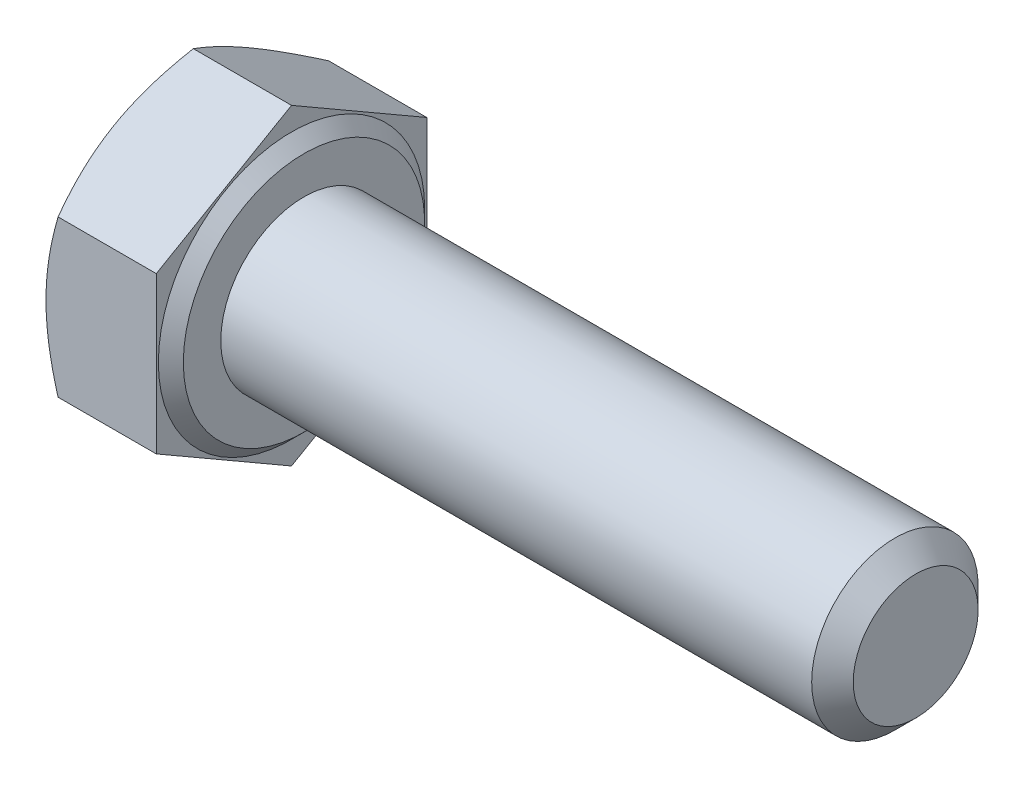
ISO-10303-21;
HEADER;
FILE_DESCRIPTION(('STEP AP214'),'2;1');
FILE_NAME('part.step','',(''),(''),'','','');
FILE_SCHEMA(('AUTOMOTIVE_DESIGN { 1 0 10303 214 1 1 1 1 }'));
ENDSEC;
DATA;
#1=APPLICATION_CONTEXT('core data for automotive mechanical design processes');
#2=APPLICATION_PROTOCOL_DEFINITION('international standard','automotive_design',2000,#1);
#3=PRODUCT_CONTEXT('',#1,'mechanical');
#4=PRODUCT('Part','Part','',(#3));
#5=PRODUCT_RELATED_PRODUCT_CATEGORY('part','',(#4));
#6=PRODUCT_DEFINITION_FORMATION('','',#4);
#7=PRODUCT_DEFINITION_CONTEXT('part definition',#1,'design');
#8=PRODUCT_DEFINITION('design','',#6,#7);
#9=PRODUCT_DEFINITION_SHAPE('','',#8);
#10=(LENGTH_UNIT() NAMED_UNIT(*) SI_UNIT(.MILLI.,.METRE.));
#11=(NAMED_UNIT(*) PLANE_ANGLE_UNIT() SI_UNIT($,.RADIAN.));
#12=(NAMED_UNIT(*) SI_UNIT($,.STERADIAN.) SOLID_ANGLE_UNIT());
#13=UNCERTAINTY_MEASURE_WITH_UNIT(LENGTH_MEASURE(1.E-05),#10,'distance_accuracy_value','');
#14=(GEOMETRIC_REPRESENTATION_CONTEXT(3) GLOBAL_UNCERTAINTY_ASSIGNED_CONTEXT((#13)) GLOBAL_UNIT_ASSIGNED_CONTEXT((#10,
#11,#12)) REPRESENTATION_CONTEXT('',''));
#15=CARTESIAN_POINT('',(0.,0.,0.));
#16=DIRECTION('',(0.,0.,1.));
#17=DIRECTION('',(1.,0.,0.));
#18=AXIS2_PLACEMENT_3D('',#15,#16,#17);
#19=CARTESIAN_POINT('',(2.65,-7.50555349946513,0.));
#20=DIRECTION('',(1.,0.,0.));
#21=DIRECTION('',(0.,0.,-1.));
#22=AXIS2_PLACEMENT_3D('',#19,#20,#21);
#23=PLANE('',#22);
#24=DIRECTION('',(0.,-0.5,-0.866025403784439));
#25=VECTOR('',#24,1.);
#26=CARTESIAN_POINT('',(2.65,-3.75277674973257,6.49999999999999));
#27=LINE('',#26,#25);
#28=CARTESIAN_POINT('',(2.65,-3.75277674973257,6.49999999999999));
#29=VERTEX_POINT('',#28);
#30=CARTESIAN_POINT('',(2.65,-7.50555349946513,0.));
#31=VERTEX_POINT('',#30);
#32=EDGE_CURVE('E121',#29,#31,#27,.T.);
#33=ORIENTED_EDGE('',*,*,#32,.T.);
#34=DIRECTION('',(0.,0.5,-0.866025403784439));
#35=VECTOR('',#34,1.);
#36=CARTESIAN_POINT('',(2.65,-7.50555349946513,0.));
#37=LINE('',#36,#35);
#38=CARTESIAN_POINT('',(2.65,-3.75277674973257,-6.5));
#39=VERTEX_POINT('',#38);
#40=EDGE_CURVE('E411',#31,#39,#37,.T.);
#41=ORIENTED_EDGE('',*,*,#40,.T.);
#42=DIRECTION('',(0.,1.,0.));
#43=VECTOR('',#42,1.);
#44=CARTESIAN_POINT('',(2.65,-3.75277674973257,-6.5));
#45=LINE('',#44,#43);
#46=CARTESIAN_POINT('',(2.65,3.75277674973257,-6.5));
#47=VERTEX_POINT('',#46);
#48=EDGE_CURVE('E417',#39,#47,#45,.T.);
#49=ORIENTED_EDGE('',*,*,#48,.T.);
#50=DIRECTION('',(0.,0.5,0.866025403784439));
#51=VECTOR('',#50,1.);
#52=CARTESIAN_POINT('',(2.65,3.75277674973257,-6.5));
#53=LINE('',#52,#51);
#54=CARTESIAN_POINT('',(2.65,7.50555349946513,0.));
#55=VERTEX_POINT('',#54);
#56=EDGE_CURVE('E416',#47,#55,#53,.T.);
#57=ORIENTED_EDGE('',*,*,#56,.T.);
#58=DIRECTION('',(0.,-0.5,0.866025403784439));
#59=VECTOR('',#58,1.);
#60=CARTESIAN_POINT('',(2.65,7.50555349946513,0.));
#61=LINE('',#60,#59);
#62=CARTESIAN_POINT('',(2.65,3.75277674973257,6.5));
#63=VERTEX_POINT('',#62);
#64=EDGE_CURVE('E294',#55,#63,#61,.T.);
#65=ORIENTED_EDGE('',*,*,#64,.T.);
#66=DIRECTION('',(0.,-1.,0.));
#67=VECTOR('',#66,1.);
#68=CARTESIAN_POINT('',(2.65,3.75277674973257,6.5));
#69=LINE('',#68,#67);
#70=EDGE_CURVE('E290',#63,#29,#69,.T.);
#71=ORIENTED_EDGE('',*,*,#70,.T.);
#72=EDGE_LOOP('',(#33,#41,#49,#57,#65,#71));
#73=FACE_BOUND('',#72,.T.);
#74=CARTESIAN_POINT('',(2.65,0.,0.));
#75=DIRECTION('',(-1.,0.,0.));
#76=DIRECTION('',(0.,0.,1.));
#77=AXIS2_PLACEMENT_3D('',#74,#75,#76);
#78=CIRCLE('',#77,6.4);
#79=CARTESIAN_POINT('',(2.65,0.,6.4));
#80=VERTEX_POINT('',#79);
#81=EDGE_CURVE('E229',#80,#80,#78,.T.);
#82=ORIENTED_EDGE('',*,*,#81,.T.);
#83=EDGE_LOOP('',(#82));
#84=FACE_BOUND('',#83,.T.);
#85=ADVANCED_FACE('F38',(#73,#84),#23,.T.);
#86=CARTESIAN_POINT('',(2.65,-3.75277674973257,6.49999999999999));
#87=DIRECTION('',(0.,0.866025403784439,-0.499999999999999));
#88=DIRECTION('',(0.,0.499999999999999,0.866025403784439));
#89=AXIS2_PLACEMENT_3D('',#86,#87,#88);
#90=PLANE('',#89);
#91=CARTESIAN_POINT('',(-2.06937674819414,-7.50566896951897,-0.000200000000000267));
#92=CARTESIAN_POINT('',(-2.11699557692452,-7.4231786300702,0.14267745905888));
#93=CARTESIAN_POINT('',(-2.1624532993973,-7.34038072665458,0.286087634534912));
#94=CARTESIAN_POINT('',(-2.24845131797696,-7.17411251123975,0.574072631317194));
#95=CARTESIAN_POINT('',(-2.28898949277198,-7.09064192560665,0.718647926571263));
#96=CARTESIAN_POINT('',(-2.4024289988768,-6.83889369625719,1.15468865052003));
#97=CARTESIAN_POINT('',(-2.46695219287126,-6.66962231516081,1.44787528284632));
#98=CARTESIAN_POINT('',(-2.54261341645251,-6.41631077211555,1.88662374554437));
#99=CARTESIAN_POINT('',(-2.56416714354301,-6.33302748139454,2.03087463649469));
#100=CARTESIAN_POINT('',(-2.60030968539388,-6.16608458377293,2.32002821713809));
#101=CARTESIAN_POINT('',(-2.61489911554033,-6.08242501078143,2.46493084809889));
#102=CARTESIAN_POINT('',(-2.63674124749265,-5.91496056339807,2.75498777942832));
#103=CARTESIAN_POINT('',(-2.64400227567789,-5.8311559625217,2.90014160605421));
#104=CARTESIAN_POINT('',(-2.65103969741777,-5.66347396979287,3.19057533697495));
#105=CARTESIAN_POINT('',(-2.65081632218779,-5.5795965802691,3.33585523723635));
#106=CARTESIAN_POINT('',(-2.63991654148483,-5.34979921898453,3.73387594242649));
#107=CARTESIAN_POINT('',(-2.62161818213059,-5.20395446807007,3.98648646102757));
#108=CARTESIAN_POINT('',(-2.56359365854233,-4.91323365606636,4.49002967823568));
#109=CARTESIAN_POINT('',(-2.52384766146176,-4.76835861741226,4.74096060593308));
#110=CARTESIAN_POINT('',(-2.42449409679785,-4.47705272008732,5.24551722064432));
#111=CARTESIAN_POINT('',(-2.36446557436198,-4.33065861912703,5.49907924143591));
#112=CARTESIAN_POINT('',(-2.22822500749014,-4.04005357906494,6.00242193575904));
#113=CARTESIAN_POINT('',(-2.15204496583641,-3.89583891821182,6.25220905555296));
#114=CARTESIAN_POINT('',(-2.06937674819414,-3.75266127967874,6.50019999999999));
#115=B_SPLINE_CURVE_WITH_KNOTS('',3,(#91,#92,#93,#94,#95,#96,#97,#98,#99,#100,#101,#102,#103,
#104,#105,#106,#107,#108,#109,#110,#111,#112,#113,#114),.UNSPECIFIED.,.F.,.F.,(4,2,2,2,2,2,2,2,
2,2,2,4),(0.,0.515105052395587,1.03043143507524,2.06322554824262,2.56697389547996,
3.07067772176453,3.57380860368927,4.07692394242519,4.95279354705659,5.82947446853465,
6.72559912449735,7.61996451221045),.UNSPECIFIED.);
#116=CARTESIAN_POINT('',(-2.06944341639924,-7.50555349946513,0.));
#117=VERTEX_POINT('',#116);
#118=CARTESIAN_POINT('',(-2.65,-5.62916512459885,3.25));
#119=VERTEX_POINT('',#118);
#120=EDGE_CURVE('E182',#117,#119,#115,.T.);
#121=ORIENTED_EDGE('',*,*,#120,.F.);
#122=DIRECTION('',(-1.,0.,0.));
#123=VECTOR('',#122,1.);
#124=CARTESIAN_POINT('',(2.65,-7.50555349946513,0.));
#125=LINE('',#124,#123);
#126=EDGE_CURVE('E135',#31,#117,#125,.T.);
#127=ORIENTED_EDGE('',*,*,#126,.F.);
#128=ORIENTED_EDGE('',*,*,#32,.F.);
#129=DIRECTION('',(-1.,0.,0.));
#130=VECTOR('',#129,1.);
#131=CARTESIAN_POINT('',(2.65,-3.75277674973257,6.49999999999999));
#132=LINE('',#131,#130);
#133=CARTESIAN_POINT('',(-2.06944341639942,-3.75277674973285,6.49999999999999));
#134=VERTEX_POINT('',#133);
#135=EDGE_CURVE('E287',#29,#134,#132,.T.);
#136=ORIENTED_EDGE('',*,*,#135,.T.);
#137=EDGE_CURVE('E177',#119,#134,#115,.T.);
#138=ORIENTED_EDGE('',*,*,#137,.F.);
#139=EDGE_LOOP('',(#121,#127,#128,#136,#138));
#140=FACE_BOUND('',#139,.T.);
#141=ADVANCED_FACE('F171',(#140),#90,.F.);
#142=CARTESIAN_POINT('',(2.65,-7.50555349946513,0.));
#143=DIRECTION('',(0.,0.866025403784439,0.5));
#144=DIRECTION('',(0.,-0.5,0.866025403784439));
#145=AXIS2_PLACEMENT_3D('',#142,#143,#144);
#146=PLANE('',#145);
#147=CARTESIAN_POINT('',(-2.06937674819414,-3.75266127967873,-6.5002));
#148=CARTESIAN_POINT('',(-2.11699557692452,-3.8351516191275,-6.35732254094112));
#149=CARTESIAN_POINT('',(-2.1624532993973,-3.91794952254312,-6.21391236546509));
#150=CARTESIAN_POINT('',(-2.24845131797696,-4.08421773795795,-5.9259273686828));
#151=CARTESIAN_POINT('',(-2.28898949277198,-4.16768832359105,-5.78135207342874));
#152=CARTESIAN_POINT('',(-2.40242899887679,-4.41943655294051,-5.34531134947997));
#153=CARTESIAN_POINT('',(-2.46695219287126,-4.58870793403689,-5.05212471715368));
#154=CARTESIAN_POINT('',(-2.54261341645251,-4.84201947708215,-4.61337625445563));
#155=CARTESIAN_POINT('',(-2.56416714354301,-4.92530276780316,-4.46912536350531));
#156=CARTESIAN_POINT('',(-2.60030968539388,-5.09224566542477,-4.17997178286191));
#157=CARTESIAN_POINT('',(-2.61489911554033,-5.17590523841627,-4.03506915190111));
#158=CARTESIAN_POINT('',(-2.63674124749265,-5.34336968579964,-3.74501222057168));
#159=CARTESIAN_POINT('',(-2.64400227567789,-5.427174286676,-3.59985839394579));
#160=CARTESIAN_POINT('',(-2.65103969741777,-5.59485627940483,-3.30942466302505));
#161=CARTESIAN_POINT('',(-2.6508163221878,-5.6787336689286,-3.16414476276364));
#162=CARTESIAN_POINT('',(-2.63991654148484,-5.90853103021317,-2.76612405757351));
#163=CARTESIAN_POINT('',(-2.62161818213059,-6.05437578112763,-2.51351353897243));
#164=CARTESIAN_POINT('',(-2.56359365854233,-6.34509659313134,-2.00997032176432));
#165=CARTESIAN_POINT('',(-2.52384766146176,-6.48997163178544,-1.75903939406692));
#166=CARTESIAN_POINT('',(-2.42449409679785,-6.78127752911038,-1.25448277935568));
#167=CARTESIAN_POINT('',(-2.36446557436198,-6.92767163007067,-1.00092075856409));
#168=CARTESIAN_POINT('',(-2.22822500749014,-7.21827667013276,-0.497578064240955));
#169=CARTESIAN_POINT('',(-2.15204496583641,-7.36249133098588,-0.247790944447036));
#170=CARTESIAN_POINT('',(-2.06937674819414,-7.50566896951897,0.000199999999999902));
#171=B_SPLINE_CURVE_WITH_KNOTS('',3,(#147,#148,#149,#150,#151,#152,#153,#154,#155,#156,#157,
#158,#159,#160,#161,#162,#163,#164,#165,#166,#167,#168,#169,#170),.UNSPECIFIED.,.F.,.F.,(4,2,2,
2,2,2,2,2,2,2,2,4),(0.,0.515105052395587,1.03043143507524,2.06322554824262,2.56697389547996,
3.07067772176453,3.57380860368927,4.07692394242519,4.9527935470566,5.82947446853466,
6.72559912449736,7.61996451221045),.UNSPECIFIED.);
#172=CARTESIAN_POINT('',(-2.06944341639924,-3.75277674973257,-6.5));
#173=VERTEX_POINT('',#172);
#174=CARTESIAN_POINT('',(-2.65,-5.62916512459885,-3.25));
#175=VERTEX_POINT('',#174);
#176=EDGE_CURVE('E130',#173,#175,#171,.T.);
#177=ORIENTED_EDGE('',*,*,#176,.F.);
#178=DIRECTION('',(-1.,0.,0.));
#179=VECTOR('',#178,1.);
#180=CARTESIAN_POINT('',(2.65,-3.75277674973257,-6.5));
#181=LINE('',#180,#179);
#182=EDGE_CURVE('E144',#39,#173,#181,.T.);
#183=ORIENTED_EDGE('',*,*,#182,.F.);
#184=ORIENTED_EDGE('',*,*,#40,.F.);
#185=ORIENTED_EDGE('',*,*,#126,.T.);
#186=EDGE_CURVE('E153',#175,#117,#171,.T.);
#187=ORIENTED_EDGE('',*,*,#186,.F.);
#188=EDGE_LOOP('',(#177,#183,#184,#185,#187));
#189=FACE_BOUND('',#188,.T.);
#190=ADVANCED_FACE('F166',(#189),#146,.F.);
#191=CARTESIAN_POINT('',(2.65,-3.75277674973257,-6.5));
#192=DIRECTION('',(0.,0.,1.));
#193=DIRECTION('',(0.,-1.,0.));
#194=AXIS2_PLACEMENT_3D('',#191,#192,#193);
#195=PLANE('',#194);
#196=CARTESIAN_POINT('',(0.60355373719635,-10.2477314892717,-6.5));
#197=CARTESIAN_POINT('',(0.464475261400692,-9.96239446416221,-6.5));
#198=CARTESIAN_POINT('',(0.32668274970438,-9.67642013820517,-6.5));
#199=CARTESIAN_POINT('',(0.0543896787091133,-9.10285860796694,-6.5));
#200=CARTESIAN_POINT('',(-0.0801103928031412,-8.81527117236299,-6.5));
#201=CARTESIAN_POINT('',(-0.345739945415969,-8.23674193681685,-6.5));
#202=CARTESIAN_POINT('',(-0.476848481026263,-7.9457904878189,-6.5));
#203=CARTESIAN_POINT('',(-0.733919368063302,-7.36163133412946,-6.5));
#204=CARTESIAN_POINT('',(-0.859881951865676,-7.06842373203112,-6.5));
#205=CARTESIAN_POINT('',(-1.1095154176263,-6.46918646835269,-6.5));
#206=CARTESIAN_POINT('',(-1.23295962840305,-6.16306188065731,-6.5));
#207=CARTESIAN_POINT('',(-1.47090398711428,-5.54729317546956,-6.5));
#208=CARTESIAN_POINT('',(-1.58540315491076,-5.23764867653513,-6.5));
#209=CARTESIAN_POINT('',(-1.80257373403833,-4.61487627079029,-6.5));
#210=CARTESIAN_POINT('',(-1.90526771872367,-4.30175631122758,-6.5));
#211=CARTESIAN_POINT('',(-2.09564259693755,-3.67102393290308,-6.5));
#212=CARTESIAN_POINT('',(-2.18332804620487,-3.35341290917758,-6.5));
#213=CARTESIAN_POINT('',(-2.33911527049905,-2.71533873469302,-6.5));
#214=CARTESIAN_POINT('',(-2.40732968158167,-2.39490351903324,-6.5));
#215=CARTESIAN_POINT('',(-2.52043149347748,-1.74983239904374,-6.5));
#216=CARTESIAN_POINT('',(-2.56532136485251,-1.42519694334302,-6.5));
#217=CARTESIAN_POINT('',(-2.61219056963229,-0.938551671037446,-6.5));
#218=CARTESIAN_POINT('',(-2.62438742928197,-0.777487825069509,-6.5));
#219=CARTESIAN_POINT('',(-2.64195788983122,-0.454981225817015,-6.5));
#220=CARTESIAN_POINT('',(-2.64733160864311,-0.293538479128636,-6.5));
#221=CARTESIAN_POINT('',(-2.6511195992042,0.0294278006686856,-6.5));
#222=CARTESIAN_POINT('',(-2.64953389424364,0.190951333505462,-6.5));
#223=CARTESIAN_POINT('',(-2.63944563744444,0.513784532096948,-6.5));
#224=CARTESIAN_POINT('',(-2.63094277147445,0.675094187805539,-6.5));
#225=CARTESIAN_POINT('',(-2.60274594615385,1.05782021915585,-6.5));
#226=CARTESIAN_POINT('',(-2.58004535742526,1.2790201787771,-6.5));
#227=CARTESIAN_POINT('',(-2.52283806687712,1.71987609764738,-6.5));
#228=CARTESIAN_POINT('',(-2.4883298965269,1.93953186137231,-6.5));
#229=CARTESIAN_POINT('',(-2.36891552307362,2.5958774986214,-6.5));
#230=CARTESIAN_POINT('',(-2.26813808604729,3.02972351119424,-6.5));
#231=CARTESIAN_POINT('',(-2.0921348657605,3.6786620168305,-6.5));
#232=CARTESIAN_POINT('',(-2.0284757231639,3.89708630013132,-6.5));
#233=CARTESIAN_POINT('',(-1.89423191702726,4.33181713101748,-6.5));
#234=CARTESIAN_POINT('',(-1.82364720395261,4.5481236634436,-6.5));
#235=CARTESIAN_POINT('',(-1.67671049639938,4.97868097873234,-6.5));
#236=CARTESIAN_POINT('',(-1.60036016744911,5.19293233527614,-6.5));
#237=CARTESIAN_POINT('',(-1.44282164032818,5.61963919711557,-6.5));
#238=CARTESIAN_POINT('',(-1.36163352310401,5.83209473239124,-6.5));
#239=CARTESIAN_POINT('',(-1.1520726731286,6.36515493176347,-6.5));
#240=CARTESIAN_POINT('',(-1.02106063071126,6.68472057021892,-6.5));
#241=CARTESIAN_POINT('',(-0.751881137922848,7.32083421355234,-6.5));
#242=CARTESIAN_POINT('',(-0.613713082142333,7.63738196042088,-6.5));
#243=CARTESIAN_POINT('',(-0.331771759273816,8.26807891677026,-6.5));
#244=CARTESIAN_POINT('',(-0.187996803941277,8.58222736923566,-6.5));
#245=CARTESIAN_POINT('',(0.103931221831426,9.2084658296306,-6.5));
#246=CARTESIAN_POINT('',(0.252084160437177,9.52055589919884,-6.5));
#247=CARTESIAN_POINT('',(0.552090353552636,10.1434744571842,-6.5));
#248=CARTESIAN_POINT('',(0.703948386045167,10.4543006400647,-6.49999999999999));
#249=CARTESIAN_POINT('',(1.01050097070058,11.0745509046012,-6.49999999999999));
#250=CARTESIAN_POINT('',(1.16519554010106,11.3839749777224,-6.49999999999999));
#251=CARTESIAN_POINT('',(1.63267217813975,12.3103970834787,-6.49999999999999));
#252=CARTESIAN_POINT('',(1.94890085256161,12.9256554316128,-6.49999999999999));
#253=CARTESIAN_POINT('',(2.55757712504277,14.0950777618092,-6.49999999999999));
#254=CARTESIAN_POINT('',(2.84945902750468,14.649537598818,-6.49999999999999));
#255=CARTESIAN_POINT('',(3.4370774767159,15.7564437556878,-6.49999999999999));
#256=CARTESIAN_POINT('',(3.73281420813998,16.3088899774474,-6.49999999999999));
#257=CARTESIAN_POINT('',(4.32629070605834,17.4105689728968,-6.49999999999999));
#258=CARTESIAN_POINT('',(4.62402181990693,17.9598064153872,-6.49999999999999));
#259=CARTESIAN_POINT('',(5.22172897927089,19.0570108358403,-6.49999999999999));
#260=CARTESIAN_POINT('',(5.52170487175015,19.6049778971337,-6.49999999999999));
#261=CARTESIAN_POINT('',(5.82250786924368,20.1524874902564,-6.49999999999999));
#262=B_SPLINE_CURVE_WITH_KNOTS('',3,(#196,#197,#198,#199,#200,#201,#202,#203,#204,#205,#206,
#207,#208,#209,#210,#211,#212,#213,#214,#215,#216,#217,#218,#219,#220,#221,#222,#223,#224,#225,
#226,#227,#228,#229,#230,#231,#232,#233,#234,#235,#236,#237,#238,#239,#240,#241,#242,#243,#244,
#245,#246,#247,#248,#249,#250,#251,#252,#253,#254,#255,#256,#257,#258,#259,#260,#261),
.UNSPECIFIED.,.F.,.F.,(4,2,2,2,2,2,2,2,2,2,2,2,2,2,2,2,2,2,2,2,2,2,2,2,2,2,2,2,2,2,2,2,4),(0.,
0.952292516357866,1.90472527465286,2.86206700064244,3.8193654480801,4.80948803045334,
5.79971895211504,6.78802374229957,7.77602800522182,8.75819533488333,9.74025861104353,
10.2247110886823,10.7091551942693,11.1935976786284,11.6780621643656,12.3447741448776,
13.0115690757446,14.3458248640298,15.0282989510481,15.7107779197667,16.3930604876938,
17.0753316427859,18.1113441188636,19.1474443867775,20.1838590716921,21.2202425787431,
22.2580417221914,23.2958471744244,25.3710897721764,27.2508576445298,29.1307159050742,
31.004943596792,32.8790446578319),.UNSPECIFIED.);
#263=CARTESIAN_POINT('',(-2.06944341639924,3.75277674973257,-6.5));
#264=VERTEX_POINT('',#263);
#265=CARTESIAN_POINT('',(-2.65,0.,-6.5));
#266=VERTEX_POINT('',#265);
#267=EDGE_CURVE('E109',#264,#266,#262,.F.);
#268=ORIENTED_EDGE('',*,*,#267,.F.);
#269=DIRECTION('',(-1.,0.,0.));
#270=VECTOR('',#269,1.);
#271=CARTESIAN_POINT('',(2.65,3.75277674973257,-6.5));
#272=LINE('',#271,#270);
#273=EDGE_CURVE('E300',#47,#264,#272,.T.);
#274=ORIENTED_EDGE('',*,*,#273,.F.);
#275=ORIENTED_EDGE('',*,*,#48,.F.);
#276=ORIENTED_EDGE('',*,*,#182,.T.);
#277=EDGE_CURVE('E122',#266,#173,#262,.F.);
#278=ORIENTED_EDGE('',*,*,#277,.F.);
#279=EDGE_LOOP('',(#268,#274,#275,#276,#278));
#280=FACE_BOUND('',#279,.T.);
#281=ADVANCED_FACE('F141',(#280),#195,.F.);
#282=CARTESIAN_POINT('',(2.65,3.75277674973257,-6.5));
#283=DIRECTION('',(0.,-0.866025403784439,0.5));
#284=DIRECTION('',(0.,-0.5,-0.866025403784439));
#285=AXIS2_PLACEMENT_3D('',#282,#283,#284);
#286=PLANE('',#285);
#287=CARTESIAN_POINT('',(-2.06937674819414,7.50566896951897,0.000200000000003345));
#288=CARTESIAN_POINT('',(-2.11699557692452,7.4231786300702,-0.142677459058877));
#289=CARTESIAN_POINT('',(-2.1624532993973,7.34038072665458,-0.286087634534909));
#290=CARTESIAN_POINT('',(-2.24845131797696,7.17411251123976,-0.57407263131719));
#291=CARTESIAN_POINT('',(-2.28898949277198,7.09064192560665,-0.71864792657126));
#292=CARTESIAN_POINT('',(-2.40242899887679,6.83889369625719,-1.15468865052003));
#293=CARTESIAN_POINT('',(-2.46695219287126,6.66962231516081,-1.44787528284631));
#294=CARTESIAN_POINT('',(-2.54261341645251,6.41631077211555,-1.88662374554437));
#295=CARTESIAN_POINT('',(-2.56416714354301,6.33302748139454,-2.03087463649468));
#296=CARTESIAN_POINT('',(-2.60030968539388,6.16608458377293,-2.32002821713808));
#297=CARTESIAN_POINT('',(-2.61489911554033,6.08242501078143,-2.46493084809888));
#298=CARTESIAN_POINT('',(-2.63674124749265,5.91496056339807,-2.75498777942831));
#299=CARTESIAN_POINT('',(-2.64400227567789,5.83115596252171,-2.9001416060542));
#300=CARTESIAN_POINT('',(-2.65103969741777,5.66347396979287,-3.19057533697494));
#301=CARTESIAN_POINT('',(-2.6508163221878,5.5795965802691,-3.33585523723635));
#302=CARTESIAN_POINT('',(-2.63991654148484,5.34979921898453,-3.73387594242649));
#303=CARTESIAN_POINT('',(-2.62161818213059,5.20395446807007,-3.98648646102757));
#304=CARTESIAN_POINT('',(-2.56359365854233,4.91323365606636,-4.49002967823567));
#305=CARTESIAN_POINT('',(-2.52384766146176,4.76835861741226,-4.74096060593308));
#306=CARTESIAN_POINT('',(-2.42449409679785,4.47705272008732,-5.24551722064432));
#307=CARTESIAN_POINT('',(-2.36446557436198,4.33065861912703,-5.49907924143591));
#308=CARTESIAN_POINT('',(-2.22822500749014,4.04005357906494,-6.00242193575904));
#309=CARTESIAN_POINT('',(-2.15204496583641,3.89583891821182,-6.25220905555296));
#310=CARTESIAN_POINT('',(-2.06937674819414,3.75266127967873,-6.5002));
#311=B_SPLINE_CURVE_WITH_KNOTS('',3,(#287,#288,#289,#290,#291,#292,#293,#294,#295,#296,#297,
#298,#299,#300,#301,#302,#303,#304,#305,#306,#307,#308,#309,#310),.UNSPECIFIED.,.F.,.F.,(4,2,2,
2,2,2,2,2,2,2,2,4),(0.,0.515105052395586,1.03043143507524,2.06322554824262,2.56697389547996,
3.07067772176453,3.57380860368927,4.07692394242519,4.9527935470566,5.82947446853466,
6.72559912449736,7.61996451221045),.UNSPECIFIED.);
#312=CARTESIAN_POINT('',(-2.06944341639924,7.50555349946513,0.));
#313=VERTEX_POINT('',#312);
#314=CARTESIAN_POINT('',(-2.65,5.62916512459885,-3.25));
#315=VERTEX_POINT('',#314);
#316=EDGE_CURVE('E53',#313,#315,#311,.T.);
#317=ORIENTED_EDGE('',*,*,#316,.F.);
#318=DIRECTION('',(-1.,0.,0.));
#319=VECTOR('',#318,1.);
#320=CARTESIAN_POINT('',(2.65,7.50555349946513,0.));
#321=LINE('',#320,#319);
#322=EDGE_CURVE('E292',#55,#313,#321,.T.);
#323=ORIENTED_EDGE('',*,*,#322,.F.);
#324=ORIENTED_EDGE('',*,*,#56,.F.);
#325=ORIENTED_EDGE('',*,*,#273,.T.);
#326=EDGE_CURVE('E116',#315,#264,#311,.T.);
#327=ORIENTED_EDGE('',*,*,#326,.F.);
#328=EDGE_LOOP('',(#317,#323,#324,#325,#327));
#329=FACE_BOUND('',#328,.T.);
#330=ADVANCED_FACE('F165',(#329),#286,.F.);
#331=CARTESIAN_POINT('',(2.65,7.50555349946513,0.));
#332=DIRECTION('',(0.,-0.866025403784439,-0.5));
#333=DIRECTION('',(0.,0.5,-0.866025403784439));
#334=AXIS2_PLACEMENT_3D('',#331,#332,#333);
#335=PLANE('',#334);
#336=CARTESIAN_POINT('',(-2.06937674819414,3.75266127967873,6.5002));
#337=CARTESIAN_POINT('',(-2.11699557692452,3.83515161912751,6.35732254094111));
#338=CARTESIAN_POINT('',(-2.1624532993973,3.91794952254313,6.21391236546508));
#339=CARTESIAN_POINT('',(-2.24845131797696,4.08421773795795,5.9259273686828));
#340=CARTESIAN_POINT('',(-2.28898949277198,4.16768832359106,5.78135207342873));
#341=CARTESIAN_POINT('',(-2.40242899887679,4.41943655294052,5.34531134947996));
#342=CARTESIAN_POINT('',(-2.46695219287126,4.5887079340369,5.05212471715368));
#343=CARTESIAN_POINT('',(-2.54261341645251,4.84201947708216,4.61337625445562));
#344=CARTESIAN_POINT('',(-2.56416714354301,4.92530276780316,4.46912536350531));
#345=CARTESIAN_POINT('',(-2.60030968539388,5.09224566542477,4.17997178286191));
#346=CARTESIAN_POINT('',(-2.61489911554033,5.17590523841628,4.03506915190111));
#347=CARTESIAN_POINT('',(-2.63674124749265,5.34336968579964,3.74501222057168));
#348=CARTESIAN_POINT('',(-2.64400227567789,5.427174286676,3.59985839394579));
#349=CARTESIAN_POINT('',(-2.65103969741777,5.59485627940484,3.30942466302505));
#350=CARTESIAN_POINT('',(-2.65081632218779,5.6787336689286,3.16414476276364));
#351=CARTESIAN_POINT('',(-2.63991654148483,5.90853103021317,2.76612405757351));
#352=CARTESIAN_POINT('',(-2.62161818213059,6.05437578112764,2.51351353897243));
#353=CARTESIAN_POINT('',(-2.56359365854232,6.34509659313135,2.00997032176432));
#354=CARTESIAN_POINT('',(-2.52384766146176,6.48997163178545,1.75903939406692));
#355=CARTESIAN_POINT('',(-2.42449409679785,6.78127752911039,1.25448277935568));
#356=CARTESIAN_POINT('',(-2.36446557436198,6.92767163007068,1.00092075856409));
#357=CARTESIAN_POINT('',(-2.22822500749014,7.21827667013277,0.497578064240958));
#358=CARTESIAN_POINT('',(-2.15204496583641,7.36249133098589,0.247790944447039));
#359=CARTESIAN_POINT('',(-2.06937674819414,7.50566896951897,-0.000199999999996806));
#360=B_SPLINE_CURVE_WITH_KNOTS('',3,(#336,#337,#338,#339,#340,#341,#342,#343,#344,#345,#346,
#347,#348,#349,#350,#351,#352,#353,#354,#355,#356,#357,#358,#359),.UNSPECIFIED.,.F.,.F.,(4,2,2,
2,2,2,2,2,2,2,2,4),(0.,0.515105052395587,1.03043143507524,2.06322554824262,2.56697389547996,
3.07067772176453,3.57380860368927,4.07692394242519,4.95279354705659,5.82947446853465,
6.72559912449735,7.61996451221045),.UNSPECIFIED.);
#361=CARTESIAN_POINT('',(-2.06944341639924,3.75277674973257,6.5));
#362=VERTEX_POINT('',#361);
#363=CARTESIAN_POINT('',(-2.65,5.62916512459885,3.25));
#364=VERTEX_POINT('',#363);
#365=EDGE_CURVE('E61',#362,#364,#360,.T.);
#366=ORIENTED_EDGE('',*,*,#365,.F.);
#367=DIRECTION('',(-1.,0.,0.));
#368=VECTOR('',#367,1.);
#369=CARTESIAN_POINT('',(2.65,3.75277674973257,6.5));
#370=LINE('',#369,#368);
#371=EDGE_CURVE('E289',#63,#362,#370,.T.);
#372=ORIENTED_EDGE('',*,*,#371,.F.);
#373=ORIENTED_EDGE('',*,*,#64,.F.);
#374=ORIENTED_EDGE('',*,*,#322,.T.);
#375=EDGE_CURVE('E190',#364,#313,#360,.T.);
#376=ORIENTED_EDGE('',*,*,#375,.F.);
#377=EDGE_LOOP('',(#366,#372,#373,#374,#376));
#378=FACE_BOUND('',#377,.T.);
#379=ADVANCED_FACE('F210',(#378),#335,.F.);
#380=CARTESIAN_POINT('',(2.65,3.75277674973257,6.5));
#381=DIRECTION('',(0.,0.,-1.));
#382=DIRECTION('',(0.,1.,0.));
#383=AXIS2_PLACEMENT_3D('',#380,#381,#382);
#384=PLANE('',#383);
#385=CARTESIAN_POINT('',(0.603553733516687,-10.2477314817244,6.49999999999999));
#386=CARTESIAN_POINT('',(0.464475257874193,-9.96239445686887,6.49999999999999));
#387=CARTESIAN_POINT('',(0.32668274633096,-9.67642013116599,6.49999999999999));
#388=CARTESIAN_POINT('',(0.0543896756411171,-9.10285860143683,6.49999999999999));
#389=CARTESIAN_POINT('',(-0.080110395718793,-8.8152711660878,6.49999999999999));
#390=CARTESIAN_POINT('',(-0.345739948026859,-8.2367419310553,6.49999999999999));
#391=CARTESIAN_POINT('',(-0.476848483484763,-7.9457904823161,6.49999999999999));
#392=CARTESIAN_POINT('',(-0.733919370219514,-7.36163132914587,6.49999999999999));
#393=CARTESIAN_POINT('',(-0.859881953871992,-7.06842372730801,6.49999999999999));
#394=CARTESIAN_POINT('',(-1.10951541932795,-6.46918646417171,6.49999999999999));
#395=CARTESIAN_POINT('',(-1.23295962995029,-6.16306187675817,6.49999999999999));
#396=CARTESIAN_POINT('',(-1.47090398836086,-5.54729317213859,6.49999999999999));
#397=CARTESIAN_POINT('',(-1.58540315601109,-5.23764867349049,6.49999999999999));
#398=CARTESIAN_POINT('',(-1.80257373485996,-4.6148762683236,6.49999999999999));
#399=CARTESIAN_POINT('',(-1.90526771941281,-4.30175630905248,6.49999999999999));
#400=CARTESIAN_POINT('',(-2.09564259738307,-3.67102393131906,6.49999999999999));
#401=CARTESIAN_POINT('',(-2.18332804653923,-3.35341290789304,6.49999999999999));
#402=CARTESIAN_POINT('',(-2.33911527060884,-2.71533873415901,6.49999999999999));
#403=CARTESIAN_POINT('',(-2.4073296815864,-2.39490351895232,6.49999999999999));
#404=CARTESIAN_POINT('',(-2.52043149334024,-1.74983239988033,6.49999999999999));
#405=CARTESIAN_POINT('',(-2.5653213646783,-1.42519694464404,6.49999999999999));
#406=CARTESIAN_POINT('',(-2.61219056946443,-0.938551673031906,6.49999999999999));
#407=CARTESIAN_POINT('',(-2.62438742912625,-0.777487827291692,6.49999999999999));
#408=CARTESIAN_POINT('',(-2.64195788971997,-0.454981228494312,6.49999999999999));
#409=CARTESIAN_POINT('',(-2.64733160856417,-0.293538482033324,6.49999999999999));
#410=CARTESIAN_POINT('',(-2.6511195992097,0.0294277973108626,6.49999999999999));
#411=CARTESIAN_POINT('',(-2.64953389430128,0.190951329921896,6.5));
#412=CARTESIAN_POINT('',(-2.63944563762482,0.513784528064791,6.5));
#413=CARTESIAN_POINT('',(-2.63094277172542,0.675094183550535,6.5));
#414=CARTESIAN_POINT('',(-2.60274594657838,1.05782021455984,6.5));
#415=CARTESIAN_POINT('',(-2.58004535794947,1.2790201740639,6.5));
#416=CARTESIAN_POINT('',(-2.52283806760597,1.71987609270518,6.5));
#417=CARTESIAN_POINT('',(-2.48832989736071,1.93953185631832,6.5));
#418=CARTESIAN_POINT('',(-2.36891552422446,2.59587749323826,6.5));
#419=CARTESIAN_POINT('',(-2.26813808741218,3.02972350560051,6.5));
#420=CARTESIAN_POINT('',(-2.09213486744098,3.67866201092192,6.5));
#421=CARTESIAN_POINT('',(-2.02847572495024,3.89708629411556,6.5));
#422=CARTESIAN_POINT('',(-1.894231919022,4.3318171247886,6.5));
#423=CARTESIAN_POINT('',(-1.82364720604987,4.54812365710878,6.5));
#424=CARTESIAN_POINT('',(-1.67671049869794,4.97868097218646,6.5));
#425=CARTESIAN_POINT('',(-1.60036016984643,5.19293232862512,6.5));
#426=CARTESIAN_POINT('',(-1.44282164291949,5.61963919025429,6.5));
#427=CARTESIAN_POINT('',(-1.36163352579055,5.83209472542482,6.5));
#428=CARTESIAN_POINT('',(-1.15207267597255,6.36515492473125,6.5));
#429=CARTESIAN_POINT('',(-1.02106063360947,6.68472056322357,6.5));
#430=CARTESIAN_POINT('',(-0.751881140915584,7.32083420662624,6.5));
#431=CARTESIAN_POINT('',(-0.613713085175322,7.63738195352715,6.5));
#432=CARTESIAN_POINT('',(-0.331771762376821,8.26807890993788,6.5));
#433=CARTESIAN_POINT('',(-0.187996807074036,8.58222736243227,6.5));
#434=CARTESIAN_POINT('',(0.103931218646835,9.20846582288206,6.5));
#435=CARTESIAN_POINT('',(0.252084157230505,9.52055589247617,6.5));
#436=CARTESIAN_POINT('',(0.552090350308237,10.1434744505123,6.5));
#437=CARTESIAN_POINT('',(0.703948382785144,10.4543006334176,6.5));
#438=CARTESIAN_POINT('',(1.01050096741376,11.0745508980019,6.5));
#439=CARTESIAN_POINT('',(1.16519553680306,11.3839749711459,6.5));
#440=CARTESIAN_POINT('',(1.6326721748131,12.3103970769681,6.5));
#441=CARTESIAN_POINT('',(1.94890084922256,12.9256554251429,6.5));
#442=CARTESIAN_POINT('',(2.5575771216728,14.0950777553839,6.5));
#443=CARTESIAN_POINT('',(2.84945902411519,14.649537592397,6.5));
#444=CARTESIAN_POINT('',(3.43707747329168,15.7564437492737,6.5));
#445=CARTESIAN_POINT('',(3.73281420470055,16.3088899710356,6.5));
#446=CARTESIAN_POINT('',(4.3262907025885,17.4105689664828,6.5));
#447=CARTESIAN_POINT('',(4.62402181642185,17.9598064089686,6.5));
#448=CARTESIAN_POINT('',(5.22172897575737,19.0570108294112,6.5));
#449=CARTESIAN_POINT('',(5.52170486822343,19.6049778906988,6.5));
#450=CARTESIAN_POINT('',(5.82250786570444,20.1524874838153,6.5));
#451=B_SPLINE_CURVE_WITH_KNOTS('',3,(#385,#386,#387,#388,#389,#390,#391,#392,#393,#394,#395,
#396,#397,#398,#399,#400,#401,#402,#403,#404,#405,#406,#407,#408,#409,#410,#411,#412,#413,#414,
#415,#416,#417,#418,#419,#420,#421,#422,#423,#424,#425,#426,#427,#428,#429,#430,#431,#432,#433,
#434,#435,#436,#437,#438,#439,#440,#441,#442,#443,#444,#445,#446,#447,#448,#449,#450),
.UNSPECIFIED.,.F.,.F.,(4,2,2,2,2,2,2,2,2,2,2,2,2,2,2,2,2,2,2,2,2,2,2,2,2,2,2,2,2,2,2,2,4),(0.,
0.952292515471637,1.90472527288027,2.86206699797432,3.81936544451653,4.80948802593244,
5.79971894663649,6.78802373586644,7.77602799783484,8.75819532610407,9.74025860087401,
10.2247110778348,10.709155182744,11.193597666425,11.678062151484,12.3447741316159,
13.0115690621028,14.3458248496262,15.0282989362467,15.7107779045676,16.3930604720981,
17.0753316267935,18.1113441029113,19.1474443708656,20.1838590558219,21.2202425629146,
22.2580417064093,23.2958471586887,25.3710897565319,27.2508576288698,29.1307158893989,
31.0049435810827,32.8790446420883),.UNSPECIFIED.);
#452=CARTESIAN_POINT('',(-2.65,0.,6.5));
#453=VERTEX_POINT('',#452);
#454=EDGE_CURVE('E192',#134,#453,#451,.T.);
#455=ORIENTED_EDGE('',*,*,#454,.F.);
#456=ORIENTED_EDGE('',*,*,#135,.F.);
#457=ORIENTED_EDGE('',*,*,#70,.F.);
#458=ORIENTED_EDGE('',*,*,#371,.T.);
#459=EDGE_CURVE('E194',#453,#362,#451,.T.);
#460=ORIENTED_EDGE('',*,*,#459,.F.);
#461=EDGE_LOOP('',(#455,#456,#457,#458,#460));
#462=FACE_BOUND('',#461,.T.);
#463=ADVANCED_FACE('F206',(#462),#384,.F.);
#464=CARTESIAN_POINT('',(-2.65,0.,0.));
#465=DIRECTION('',(1.,0.,0.));
#466=DIRECTION('',(0.,0.,-1.));
#467=AXIS2_PLACEMENT_3D('',#464,#465,#466);
#468=CONICAL_SURFACE('',#467,6.5,1.0471975511966);
#469=ORIENTED_EDGE('',*,*,#277,.T.);
#470=ORIENTED_EDGE('',*,*,#176,.T.);
#471=CARTESIAN_POINT('',(-2.65,0.,0.));
#472=DIRECTION('',(1.,0.,0.));
#473=DIRECTION('',(0.,0.,-1.));
#474=AXIS2_PLACEMENT_3D('',#471,#472,#473);
#475=CIRCLE('',#474,6.5);
#476=EDGE_CURVE('E127',#175,#266,#475,.T.);
#477=ORIENTED_EDGE('',*,*,#476,.T.);
#478=EDGE_LOOP('',(#469,#470,#477));
#479=FACE_BOUND('',#478,.T.);
#480=ADVANCED_FACE('F128',(#479),#468,.T.);
#481=ORIENTED_EDGE('',*,*,#186,.T.);
#482=ORIENTED_EDGE('',*,*,#120,.T.);
#483=EDGE_CURVE('E134',#119,#175,#475,.T.);
#484=ORIENTED_EDGE('',*,*,#483,.T.);
#485=EDGE_LOOP('',(#481,#482,#484));
#486=FACE_BOUND('',#485,.T.);
#487=ADVANCED_FACE('F271',(#486),#468,.T.);
#488=ORIENTED_EDGE('',*,*,#137,.T.);
#489=ORIENTED_EDGE('',*,*,#454,.T.);
#490=EDGE_CURVE('E282',#453,#119,#475,.T.);
#491=ORIENTED_EDGE('',*,*,#490,.T.);
#492=EDGE_LOOP('',(#488,#489,#491));
#493=FACE_BOUND('',#492,.T.);
#494=ADVANCED_FACE('F270',(#493),#468,.T.);
#495=ORIENTED_EDGE('',*,*,#365,.T.);
#496=CARTESIAN_POINT('',(-2.65,0.,0.));
#497=DIRECTION('',(-1.,0.,0.));
#498=DIRECTION('',(0.,0.,1.));
#499=AXIS2_PLACEMENT_3D('',#496,#497,#498);
#500=CIRCLE('',#499,6.5);
#501=EDGE_CURVE('E199',#453,#364,#500,.T.);
#502=ORIENTED_EDGE('',*,*,#501,.F.);
#503=ORIENTED_EDGE('',*,*,#459,.T.);
#504=EDGE_LOOP('',(#495,#502,#503));
#505=FACE_BOUND('',#504,.T.);
#506=ADVANCED_FACE('F266',(#505),#468,.T.);
#507=ORIENTED_EDGE('',*,*,#316,.T.);
#508=EDGE_CURVE('E139',#315,#364,#475,.T.);
#509=ORIENTED_EDGE('',*,*,#508,.T.);
#510=ORIENTED_EDGE('',*,*,#375,.T.);
#511=EDGE_LOOP('',(#507,#509,#510));
#512=FACE_BOUND('',#511,.T.);
#513=ADVANCED_FACE('F265',(#512),#468,.T.);
#514=ORIENTED_EDGE('',*,*,#267,.T.);
#515=EDGE_CURVE('E113',#266,#315,#475,.T.);
#516=ORIENTED_EDGE('',*,*,#515,.T.);
#517=ORIENTED_EDGE('',*,*,#326,.T.);
#518=EDGE_LOOP('',(#514,#516,#517));
#519=FACE_BOUND('',#518,.T.);
#520=ADVANCED_FACE('F111',(#519),#468,.T.);
#521=CARTESIAN_POINT('',(-2.65,-7.50555349946513,0.));
#522=DIRECTION('',(1.,0.,0.));
#523=DIRECTION('',(0.,0.,-1.));
#524=AXIS2_PLACEMENT_3D('',#521,#522,#523);
#525=PLANE('',#524);
#526=ORIENTED_EDGE('',*,*,#515,.F.);
#527=ORIENTED_EDGE('',*,*,#476,.F.);
#528=ORIENTED_EDGE('',*,*,#483,.F.);
#529=ORIENTED_EDGE('',*,*,#490,.F.);
#530=ORIENTED_EDGE('',*,*,#501,.T.);
#531=ORIENTED_EDGE('',*,*,#508,.F.);
#532=EDGE_LOOP('',(#526,#527,#528,#529,#530,#531));
#533=FACE_BOUND('',#532,.T.);
#534=ADVANCED_FACE('F137',(#533),#525,.F.);
#535=CARTESIAN_POINT('',(3.25,0.,0.));
#536=DIRECTION('',(-1.,0.,0.));
#537=DIRECTION('',(0.,0.,1.));
#538=AXIS2_PLACEMENT_3D('',#535,#536,#537);
#539=CONICAL_SURFACE('',#538,5.8,0.78539816339745);
#540=ORIENTED_EDGE('',*,*,#81,.F.);
#541=EDGE_LOOP('',(#540));
#542=FACE_BOUND('',#541,.T.);
#543=CARTESIAN_POINT('',(3.25,0.,0.));
#544=DIRECTION('',(-1.,0.,0.));
#545=DIRECTION('',(0.,0.,1.));
#546=AXIS2_PLACEMENT_3D('',#543,#544,#545);
#547=CIRCLE('',#546,5.8);
#548=CARTESIAN_POINT('',(3.25,0.,5.8));
#549=VERTEX_POINT('',#548);
#550=EDGE_CURVE('E231',#549,#549,#547,.T.);
#551=ORIENTED_EDGE('',*,*,#550,.T.);
#552=EDGE_LOOP('',(#551));
#553=FACE_BOUND('',#552,.T.);
#554=ADVANCED_FACE('F252',(#542,#553),#539,.T.);
#555=CARTESIAN_POINT('',(3.25,5.8,0.));
#556=DIRECTION('',(-1.,0.,0.));
#557=DIRECTION('',(0.,0.,1.));
#558=AXIS2_PLACEMENT_3D('',#555,#556,#557);
#559=PLANE('',#558);
#560=ORIENTED_EDGE('',*,*,#550,.F.);
#561=EDGE_LOOP('',(#560));
#562=FACE_BOUND('',#561,.T.);
#563=CARTESIAN_POINT('',(3.25,0.,0.));
#564=DIRECTION('',(-1.,0.,0.));
#565=DIRECTION('',(0.,0.,1.));
#566=AXIS2_PLACEMENT_3D('',#563,#564,#565);
#567=CIRCLE('',#566,4.);
#568=CARTESIAN_POINT('',(3.25,0.,4.));
#569=VERTEX_POINT('',#568);
#570=EDGE_CURVE('E233',#569,#569,#567,.T.);
#571=ORIENTED_EDGE('',*,*,#570,.T.);
#572=EDGE_LOOP('',(#571));
#573=FACE_BOUND('',#572,.T.);
#574=ADVANCED_FACE('F239',(#562,#573),#559,.F.);
#575=CARTESIAN_POINT('',(-4.54375691494385,0.,0.));
#576=DIRECTION('',(-1.,0.,0.));
#577=DIRECTION('',(0.,0.,1.));
#578=AXIS2_PLACEMENT_3D('',#575,#576,#577);
#579=CYLINDRICAL_SURFACE('',#578,4.);
#580=CARTESIAN_POINT('',(31.65,0.,0.));
#581=DIRECTION('',(-1.,0.,0.));
#582=DIRECTION('',(0.,0.,1.));
#583=AXIS2_PLACEMENT_3D('',#580,#581,#582);
#584=CIRCLE('',#583,4.);
#585=CARTESIAN_POINT('',(31.65,0.,4.));
#586=VERTEX_POINT('',#585);
#587=EDGE_CURVE('E46',#586,#586,#584,.T.);
#588=ORIENTED_EDGE('',*,*,#587,.T.);
#589=EDGE_LOOP('',(#588));
#590=FACE_BOUND('',#589,.T.);
#591=ORIENTED_EDGE('',*,*,#570,.F.);
#592=EDGE_LOOP('',(#591));
#593=FACE_BOUND('',#592,.T.);
#594=ADVANCED_FACE('F241',(#590,#593),#579,.T.);
#595=CARTESIAN_POINT('',(32.65,4.,0.));
#596=DIRECTION('',(-1.,0.,0.));
#597=DIRECTION('',(0.,0.,1.));
#598=AXIS2_PLACEMENT_3D('',#595,#596,#597);
#599=PLANE('',#598);
#600=CARTESIAN_POINT('',(32.65,0.,0.));
#601=DIRECTION('',(-1.,0.,0.));
#602=DIRECTION('',(0.,0.,1.));
#603=AXIS2_PLACEMENT_3D('',#600,#601,#602);
#604=CIRCLE('',#603,2.99999999999999);
#605=CARTESIAN_POINT('',(32.65,0.,2.99999999999999));
#606=VERTEX_POINT('',#605);
#607=EDGE_CURVE('E11',#606,#606,#604,.F.);
#608=ORIENTED_EDGE('',*,*,#607,.T.);
#609=EDGE_LOOP('',(#608));
#610=FACE_BOUND('',#609,.T.);
#611=ADVANCED_FACE('F243',(#610),#599,.F.);
#612=CARTESIAN_POINT('',(31.65,0.,0.));
#613=DIRECTION('',(-1.,0.,0.));
#614=DIRECTION('',(0.,0.,1.));
#615=AXIS2_PLACEMENT_3D('',#612,#613,#614);
#616=CONICAL_SURFACE('',#615,4.,0.785398163397452);
#617=ORIENTED_EDGE('',*,*,#607,.F.);
#618=EDGE_LOOP('',(#617));
#619=FACE_BOUND('',#618,.T.);
#620=ORIENTED_EDGE('',*,*,#587,.F.);
#621=EDGE_LOOP('',(#620));
#622=FACE_BOUND('',#621,.T.);
#623=ADVANCED_FACE('F40',(#619,#622),#616,.T.);
#624=CLOSED_SHELL('',(#85,#141,#190,#281,#330,#379,#463,#480,#487,#494,#506,#513,#520,#534,#554,
#574,#594,#611,#623));
#625=MANIFOLD_SOLID_BREP('B2',#624);
#626=ADVANCED_BREP_SHAPE_REPRESENTATION('',(#18,#625),#14);
#627=SHAPE_DEFINITION_REPRESENTATION(#9,#626);
ENDSEC;
END-ISO-10303-21;
